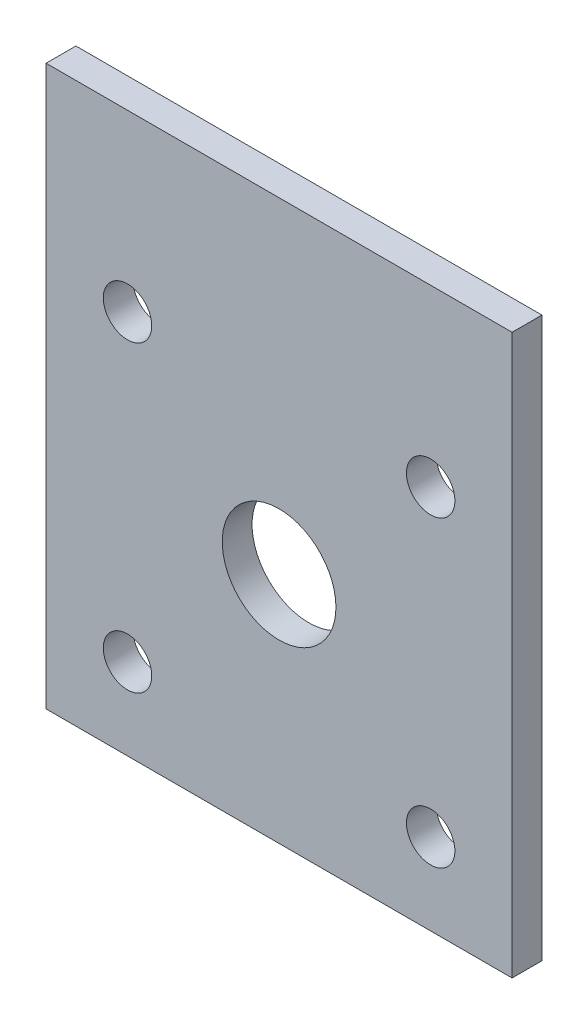
ISO-10303-21;
HEADER;
FILE_DESCRIPTION(('STEP AP214'),'2;1');
FILE_NAME('part.step','',(''),(''),'','','');
FILE_SCHEMA(('AUTOMOTIVE_DESIGN { 1 0 10303 214 1 1 1 1 }'));
ENDSEC;
DATA;
#1=APPLICATION_CONTEXT('core data for automotive mechanical design processes');
#2=APPLICATION_PROTOCOL_DEFINITION('international standard','automotive_design',2000,#1);
#3=PRODUCT_CONTEXT('',#1,'mechanical');
#4=PRODUCT('Part','Part','',(#3));
#5=PRODUCT_RELATED_PRODUCT_CATEGORY('part','',(#4));
#6=PRODUCT_DEFINITION_FORMATION('','',#4);
#7=PRODUCT_DEFINITION_CONTEXT('part definition',#1,'design');
#8=PRODUCT_DEFINITION('design','',#6,#7);
#9=PRODUCT_DEFINITION_SHAPE('','',#8);
#10=(LENGTH_UNIT() NAMED_UNIT(*) SI_UNIT(.MILLI.,.METRE.));
#11=(NAMED_UNIT(*) PLANE_ANGLE_UNIT() SI_UNIT($,.RADIAN.));
#12=(NAMED_UNIT(*) SI_UNIT($,.STERADIAN.) SOLID_ANGLE_UNIT());
#13=UNCERTAINTY_MEASURE_WITH_UNIT(LENGTH_MEASURE(1.E-05),#10,'distance_accuracy_value','');
#14=(GEOMETRIC_REPRESENTATION_CONTEXT(3) GLOBAL_UNCERTAINTY_ASSIGNED_CONTEXT((#13)) GLOBAL_UNIT_ASSIGNED_CONTEXT((#10,
#11,#12)) REPRESENTATION_CONTEXT('',''));
#15=CARTESIAN_POINT('',(0.,0.,0.));
#16=DIRECTION('',(0.,0.,1.));
#17=DIRECTION('',(1.,0.,0.));
#18=AXIS2_PLACEMENT_3D('',#15,#16,#17);
#19=CARTESIAN_POINT('',(0.,0.,1.6));
#20=DIRECTION('',(0.,0.,-1.));
#21=DIRECTION('',(-1.,0.,0.));
#22=AXIS2_PLACEMENT_3D('',#19,#20,#21);
#23=PLANE('',#22);
#24=DIRECTION('',(0.,-1.,0.));
#25=VECTOR('',#24,1.);
#26=CARTESIAN_POINT('',(0.,0.,1.6));
#27=LINE('',#26,#25);
#28=CARTESIAN_POINT('',(0.,30.,1.6));
#29=VERTEX_POINT('',#28);
#30=CARTESIAN_POINT('',(0.,0.,1.6));
#31=VERTEX_POINT('',#30);
#32=EDGE_CURVE('E88',#29,#31,#27,.T.);
#33=ORIENTED_EDGE('',*,*,#32,.T.);
#34=DIRECTION('',(1.,0.,0.));
#35=VECTOR('',#34,1.);
#36=CARTESIAN_POINT('',(0.,0.,1.6));
#37=LINE('',#36,#35);
#38=CARTESIAN_POINT('',(25.,0.,1.6));
#39=VERTEX_POINT('',#38);
#40=EDGE_CURVE('E83',#31,#39,#37,.T.);
#41=ORIENTED_EDGE('',*,*,#40,.T.);
#42=DIRECTION('',(0.,1.,0.));
#43=VECTOR('',#42,1.);
#44=CARTESIAN_POINT('',(25.,0.,1.6));
#45=LINE('',#44,#43);
#46=CARTESIAN_POINT('',(25.,30.,1.6));
#47=VERTEX_POINT('',#46);
#48=EDGE_CURVE('E86',#39,#47,#45,.T.);
#49=ORIENTED_EDGE('',*,*,#48,.T.);
#50=DIRECTION('',(-1.,0.,0.));
#51=VECTOR('',#50,1.);
#52=CARTESIAN_POINT('',(0.,30.,1.6));
#53=LINE('',#52,#51);
#54=EDGE_CURVE('E53',#47,#29,#53,.T.);
#55=ORIENTED_EDGE('',*,*,#54,.T.);
#56=EDGE_LOOP('',(#33,#41,#49,#55));
#57=FACE_BOUND('',#56,.T.);
#58=CARTESIAN_POINT('',(4.3682720163547,20.6317279836453,1.6));
#59=DIRECTION('',(0.,0.,1.));
#60=DIRECTION('',(1.,0.,0.));
#61=AXIS2_PLACEMENT_3D('',#58,#59,#60);
#62=CIRCLE('',#61,1.3);
#63=CARTESIAN_POINT('',(5.6682720163547,20.6317279836453,1.6));
#64=VERTEX_POINT('',#63);
#65=EDGE_CURVE('E103',#64,#64,#62,.T.);
#66=ORIENTED_EDGE('',*,*,#65,.F.);
#67=EDGE_LOOP('',(#66));
#68=FACE_BOUND('',#67,.T.);
#69=CARTESIAN_POINT('',(20.6317279836453,20.6317279836453,1.6));
#70=DIRECTION('',(0.,0.,1.));
#71=DIRECTION('',(-1.,0.,0.));
#72=AXIS2_PLACEMENT_3D('',#69,#70,#71);
#73=CIRCLE('',#72,1.3);
#74=CARTESIAN_POINT('',(19.3317279836453,20.6317279836453,1.6));
#75=VERTEX_POINT('',#74);
#76=EDGE_CURVE('E118',#75,#75,#73,.T.);
#77=ORIENTED_EDGE('',*,*,#76,.F.);
#78=EDGE_LOOP('',(#77));
#79=FACE_BOUND('',#78,.T.);
#80=CARTESIAN_POINT('',(20.6317279836453,4.36827201635471,1.6));
#81=DIRECTION('',(0.,0.,1.));
#82=DIRECTION('',(1.,0.,0.));
#83=AXIS2_PLACEMENT_3D('',#80,#81,#82);
#84=CIRCLE('',#83,1.3);
#85=CARTESIAN_POINT('',(21.9317279836453,4.36827201635471,1.6));
#86=VERTEX_POINT('',#85);
#87=EDGE_CURVE('E124',#86,#86,#84,.T.);
#88=ORIENTED_EDGE('',*,*,#87,.F.);
#89=EDGE_LOOP('',(#88));
#90=FACE_BOUND('',#89,.T.);
#91=CARTESIAN_POINT('',(4.3682720163547,4.36827201635471,1.6));
#92=DIRECTION('',(0.,0.,1.));
#93=DIRECTION('',(-1.,0.,0.));
#94=AXIS2_PLACEMENT_3D('',#91,#92,#93);
#95=CIRCLE('',#94,1.3);
#96=CARTESIAN_POINT('',(3.0682720163547,4.36827201635471,1.6));
#97=VERTEX_POINT('',#96);
#98=EDGE_CURVE('E130',#97,#97,#95,.T.);
#99=ORIENTED_EDGE('',*,*,#98,.F.);
#100=EDGE_LOOP('',(#99));
#101=FACE_BOUND('',#100,.T.);
#102=CARTESIAN_POINT('',(12.5,12.5,1.6));
#103=DIRECTION('',(0.,0.,1.));
#104=DIRECTION('',(1.,0.,0.));
#105=AXIS2_PLACEMENT_3D('',#102,#103,#104);
#106=CIRCLE('',#105,3.05);
#107=CARTESIAN_POINT('',(15.55,12.5,1.6));
#108=VERTEX_POINT('',#107);
#109=EDGE_CURVE('E136',#108,#108,#106,.T.);
#110=ORIENTED_EDGE('',*,*,#109,.F.);
#111=EDGE_LOOP('',(#110));
#112=FACE_BOUND('',#111,.T.);
#113=ADVANCED_FACE('F36',(#57,#68,#79,#90,#101,#112),#23,.F.);
#114=CARTESIAN_POINT('',(0.,0.,0.));
#115=DIRECTION('',(0.,0.,-1.));
#116=DIRECTION('',(-1.,0.,0.));
#117=AXIS2_PLACEMENT_3D('',#114,#115,#116);
#118=PLANE('',#117);
#119=CARTESIAN_POINT('',(4.3682720163547,4.36827201635471,0.));
#120=DIRECTION('',(0.,0.,1.));
#121=DIRECTION('',(-1.,0.,0.));
#122=AXIS2_PLACEMENT_3D('',#119,#120,#121);
#123=CIRCLE('',#122,1.3);
#124=CARTESIAN_POINT('',(3.0682720163547,4.36827201635471,0.));
#125=VERTEX_POINT('',#124);
#126=EDGE_CURVE('E133',#125,#125,#123,.T.);
#127=ORIENTED_EDGE('',*,*,#126,.T.);
#128=EDGE_LOOP('',(#127));
#129=FACE_BOUND('',#128,.T.);
#130=CARTESIAN_POINT('',(20.6317279836453,20.6317279836453,0.));
#131=DIRECTION('',(0.,0.,1.));
#132=DIRECTION('',(-1.,0.,0.));
#133=AXIS2_PLACEMENT_3D('',#130,#131,#132);
#134=CIRCLE('',#133,1.3);
#135=CARTESIAN_POINT('',(19.3317279836453,20.6317279836453,0.));
#136=VERTEX_POINT('',#135);
#137=EDGE_CURVE('E121',#136,#136,#134,.T.);
#138=ORIENTED_EDGE('',*,*,#137,.T.);
#139=EDGE_LOOP('',(#138));
#140=FACE_BOUND('',#139,.T.);
#141=DIRECTION('',(0.,-1.,0.));
#142=VECTOR('',#141,1.);
#143=CARTESIAN_POINT('',(0.,0.,0.));
#144=LINE('',#143,#142);
#145=CARTESIAN_POINT('',(0.,30.,0.));
#146=VERTEX_POINT('',#145);
#147=CARTESIAN_POINT('',(0.,0.,0.));
#148=VERTEX_POINT('',#147);
#149=EDGE_CURVE('E100',#146,#148,#144,.T.);
#150=ORIENTED_EDGE('',*,*,#149,.F.);
#151=DIRECTION('',(-1.,0.,0.));
#152=VECTOR('',#151,1.);
#153=CARTESIAN_POINT('',(0.,30.,0.));
#154=LINE('',#153,#152);
#155=CARTESIAN_POINT('',(25.,30.,0.));
#156=VERTEX_POINT('',#155);
#157=EDGE_CURVE('E76',#156,#146,#154,.T.);
#158=ORIENTED_EDGE('',*,*,#157,.F.);
#159=DIRECTION('',(0.,1.,0.));
#160=VECTOR('',#159,1.);
#161=CARTESIAN_POINT('',(25.,0.,0.));
#162=LINE('',#161,#160);
#163=CARTESIAN_POINT('',(25.,0.,0.));
#164=VERTEX_POINT('',#163);
#165=EDGE_CURVE('E70',#164,#156,#162,.T.);
#166=ORIENTED_EDGE('',*,*,#165,.F.);
#167=DIRECTION('',(1.,0.,0.));
#168=VECTOR('',#167,1.);
#169=CARTESIAN_POINT('',(0.,0.,0.));
#170=LINE('',#169,#168);
#171=EDGE_CURVE('E92',#148,#164,#170,.T.);
#172=ORIENTED_EDGE('',*,*,#171,.F.);
#173=EDGE_LOOP('',(#150,#158,#166,#172));
#174=FACE_BOUND('',#173,.T.);
#175=CARTESIAN_POINT('',(4.3682720163547,20.6317279836453,0.));
#176=DIRECTION('',(0.,0.,1.));
#177=DIRECTION('',(1.,0.,0.));
#178=AXIS2_PLACEMENT_3D('',#175,#176,#177);
#179=CIRCLE('',#178,1.3);
#180=CARTESIAN_POINT('',(5.6682720163547,20.6317279836453,0.));
#181=VERTEX_POINT('',#180);
#182=EDGE_CURVE('E115',#181,#181,#179,.T.);
#183=ORIENTED_EDGE('',*,*,#182,.T.);
#184=EDGE_LOOP('',(#183));
#185=FACE_BOUND('',#184,.T.);
#186=CARTESIAN_POINT('',(20.6317279836453,4.36827201635471,0.));
#187=DIRECTION('',(0.,0.,1.));
#188=DIRECTION('',(1.,0.,0.));
#189=AXIS2_PLACEMENT_3D('',#186,#187,#188);
#190=CIRCLE('',#189,1.3);
#191=CARTESIAN_POINT('',(21.9317279836453,4.36827201635471,0.));
#192=VERTEX_POINT('',#191);
#193=EDGE_CURVE('E127',#192,#192,#190,.T.);
#194=ORIENTED_EDGE('',*,*,#193,.T.);
#195=EDGE_LOOP('',(#194));
#196=FACE_BOUND('',#195,.T.);
#197=CARTESIAN_POINT('',(12.5,12.5,0.));
#198=DIRECTION('',(0.,0.,1.));
#199=DIRECTION('',(1.,0.,0.));
#200=AXIS2_PLACEMENT_3D('',#197,#198,#199);
#201=CIRCLE('',#200,3.05);
#202=CARTESIAN_POINT('',(15.55,12.5,0.));
#203=VERTEX_POINT('',#202);
#204=EDGE_CURVE('E139',#203,#203,#201,.T.);
#205=ORIENTED_EDGE('',*,*,#204,.T.);
#206=EDGE_LOOP('',(#205));
#207=FACE_BOUND('',#206,.T.);
#208=ADVANCED_FACE('F111',(#129,#140,#174,#185,#196,#207),#118,.T.);
#209=CARTESIAN_POINT('',(0.,0.,1.6));
#210=DIRECTION('',(1.,0.,0.));
#211=DIRECTION('',(0.,0.,-1.));
#212=AXIS2_PLACEMENT_3D('',#209,#210,#211);
#213=PLANE('',#212);
#214=ORIENTED_EDGE('',*,*,#149,.T.);
#215=DIRECTION('',(0.,0.,-1.));
#216=VECTOR('',#215,1.);
#217=CARTESIAN_POINT('',(0.,0.,1.6));
#218=LINE('',#217,#216);
#219=EDGE_CURVE('E11',#31,#148,#218,.T.);
#220=ORIENTED_EDGE('',*,*,#219,.F.);
#221=ORIENTED_EDGE('',*,*,#32,.F.);
#222=DIRECTION('',(0.,0.,-1.));
#223=VECTOR('',#222,1.);
#224=CARTESIAN_POINT('',(0.,30.,1.6));
#225=LINE('',#224,#223);
#226=EDGE_CURVE('E96',#29,#146,#225,.T.);
#227=ORIENTED_EDGE('',*,*,#226,.T.);
#228=EDGE_LOOP('',(#214,#220,#221,#227));
#229=FACE_BOUND('',#228,.T.);
#230=ADVANCED_FACE('F38',(#229),#213,.F.);
#231=CARTESIAN_POINT('',(0.,0.,1.6));
#232=DIRECTION('',(0.,1.,0.));
#233=DIRECTION('',(0.,0.,1.));
#234=AXIS2_PLACEMENT_3D('',#231,#232,#233);
#235=PLANE('',#234);
#236=ORIENTED_EDGE('',*,*,#171,.T.);
#237=DIRECTION('',(0.,0.,-1.));
#238=VECTOR('',#237,1.);
#239=CARTESIAN_POINT('',(25.,0.,1.6));
#240=LINE('',#239,#238);
#241=EDGE_CURVE('E45',#39,#164,#240,.T.);
#242=ORIENTED_EDGE('',*,*,#241,.F.);
#243=ORIENTED_EDGE('',*,*,#40,.F.);
#244=ORIENTED_EDGE('',*,*,#219,.T.);
#245=EDGE_LOOP('',(#236,#242,#243,#244));
#246=FACE_BOUND('',#245,.T.);
#247=ADVANCED_FACE('F91',(#246),#235,.F.);
#248=CARTESIAN_POINT('',(25.,0.,1.6));
#249=DIRECTION('',(-1.,0.,0.));
#250=DIRECTION('',(0.,0.,1.));
#251=AXIS2_PLACEMENT_3D('',#248,#249,#250);
#252=PLANE('',#251);
#253=ORIENTED_EDGE('',*,*,#165,.T.);
#254=DIRECTION('',(0.,0.,-1.));
#255=VECTOR('',#254,1.);
#256=CARTESIAN_POINT('',(25.,30.,1.6));
#257=LINE('',#256,#255);
#258=EDGE_CURVE('E93',#47,#156,#257,.T.);
#259=ORIENTED_EDGE('',*,*,#258,.F.);
#260=ORIENTED_EDGE('',*,*,#48,.F.);
#261=ORIENTED_EDGE('',*,*,#241,.T.);
#262=EDGE_LOOP('',(#253,#259,#260,#261));
#263=FACE_BOUND('',#262,.T.);
#264=ADVANCED_FACE('F94',(#263),#252,.F.);
#265=CARTESIAN_POINT('',(0.,30.,1.6));
#266=DIRECTION('',(0.,-1.,0.));
#267=DIRECTION('',(0.,0.,-1.));
#268=AXIS2_PLACEMENT_3D('',#265,#266,#267);
#269=PLANE('',#268);
#270=ORIENTED_EDGE('',*,*,#157,.T.);
#271=ORIENTED_EDGE('',*,*,#226,.F.);
#272=ORIENTED_EDGE('',*,*,#54,.F.);
#273=ORIENTED_EDGE('',*,*,#258,.T.);
#274=EDGE_LOOP('',(#270,#271,#272,#273));
#275=FACE_BOUND('',#274,.T.);
#276=ADVANCED_FACE('F108',(#275),#269,.F.);
#277=CARTESIAN_POINT('',(4.3682720163547,20.6317279836453,1.6));
#278=DIRECTION('',(0.,0.,-1.));
#279=DIRECTION('',(-1.,0.,0.));
#280=AXIS2_PLACEMENT_3D('',#277,#278,#279);
#281=CYLINDRICAL_SURFACE('',#280,1.3);
#282=ORIENTED_EDGE('',*,*,#65,.T.);
#283=EDGE_LOOP('',(#282));
#284=FACE_BOUND('',#283,.T.);
#285=ORIENTED_EDGE('',*,*,#182,.F.);
#286=EDGE_LOOP('',(#285));
#287=FACE_BOUND('',#286,.T.);
#288=ADVANCED_FACE('F156',(#284,#287),#281,.F.);
#289=CARTESIAN_POINT('',(20.6317279836453,20.6317279836453,1.6));
#290=DIRECTION('',(0.,0.,-1.));
#291=DIRECTION('',(-1.,0.,0.));
#292=AXIS2_PLACEMENT_3D('',#289,#290,#291);
#293=CYLINDRICAL_SURFACE('',#292,1.3);
#294=ORIENTED_EDGE('',*,*,#76,.T.);
#295=EDGE_LOOP('',(#294));
#296=FACE_BOUND('',#295,.T.);
#297=ORIENTED_EDGE('',*,*,#137,.F.);
#298=EDGE_LOOP('',(#297));
#299=FACE_BOUND('',#298,.T.);
#300=ADVANCED_FACE('F210',(#296,#299),#293,.F.);
#301=CARTESIAN_POINT('',(20.6317279836453,4.36827201635471,1.6));
#302=DIRECTION('',(0.,0.,-1.));
#303=DIRECTION('',(-1.,0.,0.));
#304=AXIS2_PLACEMENT_3D('',#301,#302,#303);
#305=CYLINDRICAL_SURFACE('',#304,1.3);
#306=ORIENTED_EDGE('',*,*,#87,.T.);
#307=EDGE_LOOP('',(#306));
#308=FACE_BOUND('',#307,.T.);
#309=ORIENTED_EDGE('',*,*,#193,.F.);
#310=EDGE_LOOP('',(#309));
#311=FACE_BOUND('',#310,.T.);
#312=ADVANCED_FACE('F219',(#308,#311),#305,.F.);
#313=CARTESIAN_POINT('',(4.3682720163547,4.36827201635471,1.6));
#314=DIRECTION('',(0.,0.,-1.));
#315=DIRECTION('',(-1.,0.,0.));
#316=AXIS2_PLACEMENT_3D('',#313,#314,#315);
#317=CYLINDRICAL_SURFACE('',#316,1.3);
#318=ORIENTED_EDGE('',*,*,#98,.T.);
#319=EDGE_LOOP('',(#318));
#320=FACE_BOUND('',#319,.T.);
#321=ORIENTED_EDGE('',*,*,#126,.F.);
#322=EDGE_LOOP('',(#321));
#323=FACE_BOUND('',#322,.T.);
#324=ADVANCED_FACE('F228',(#320,#323),#317,.F.);
#325=CARTESIAN_POINT('',(12.5,12.5,1.6));
#326=DIRECTION('',(0.,0.,-1.));
#327=DIRECTION('',(-1.,0.,0.));
#328=AXIS2_PLACEMENT_3D('',#325,#326,#327);
#329=CYLINDRICAL_SURFACE('',#328,3.05);
#330=ORIENTED_EDGE('',*,*,#109,.T.);
#331=EDGE_LOOP('',(#330));
#332=FACE_BOUND('',#331,.T.);
#333=ORIENTED_EDGE('',*,*,#204,.F.);
#334=EDGE_LOOP('',(#333));
#335=FACE_BOUND('',#334,.T.);
#336=ADVANCED_FACE('F145',(#332,#335),#329,.F.);
#337=CLOSED_SHELL('',(#113,#208,#230,#247,#264,#276,#288,#300,#312,#324,#336));
#338=MANIFOLD_SOLID_BREP('B2',#337);
#339=ADVANCED_BREP_SHAPE_REPRESENTATION('',(#18,#338),#14);
#340=SHAPE_DEFINITION_REPRESENTATION(#9,#339);
ENDSEC;
END-ISO-10303-21;
